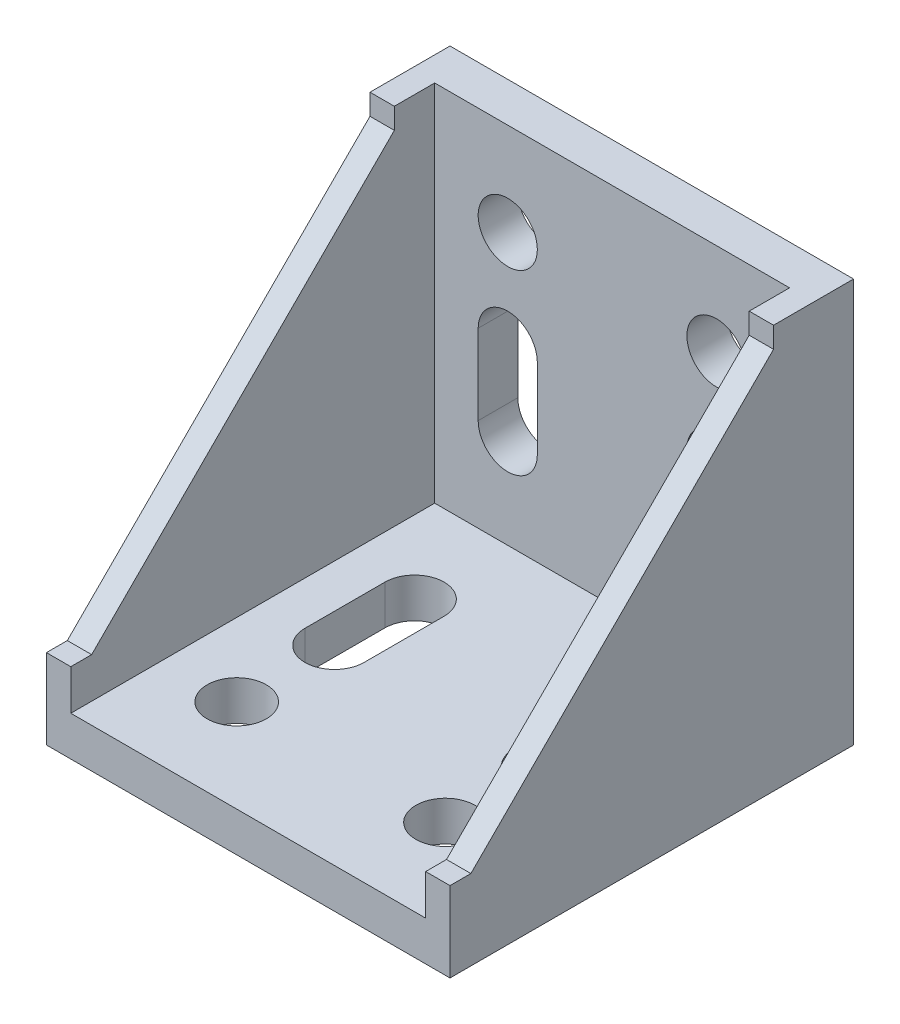
ISO-10303-21;
HEADER;
FILE_DESCRIPTION(('STEP AP214'),'2;1');
FILE_NAME('part.step','',(''),(''),'','','');
FILE_SCHEMA(('AUTOMOTIVE_DESIGN { 1 0 10303 214 1 1 1 1 }'));
ENDSEC;
DATA;
#1=APPLICATION_CONTEXT('core data for automotive mechanical design processes');
#2=APPLICATION_PROTOCOL_DEFINITION('international standard','automotive_design',2000,#1);
#3=PRODUCT_CONTEXT('',#1,'mechanical');
#4=PRODUCT('Part','Part','',(#3));
#5=PRODUCT_RELATED_PRODUCT_CATEGORY('part','',(#4));
#6=PRODUCT_DEFINITION_FORMATION('','',#4);
#7=PRODUCT_DEFINITION_CONTEXT('part definition',#1,'design');
#8=PRODUCT_DEFINITION('design','',#6,#7);
#9=PRODUCT_DEFINITION_SHAPE('','',#8);
#10=(LENGTH_UNIT() NAMED_UNIT(*) SI_UNIT(.MILLI.,.METRE.));
#11=(NAMED_UNIT(*) PLANE_ANGLE_UNIT() SI_UNIT($,.RADIAN.));
#12=(NAMED_UNIT(*) SI_UNIT($,.STERADIAN.) SOLID_ANGLE_UNIT());
#13=UNCERTAINTY_MEASURE_WITH_UNIT(LENGTH_MEASURE(1.E-05),#10,'distance_accuracy_value','');
#14=(GEOMETRIC_REPRESENTATION_CONTEXT(3) GLOBAL_UNCERTAINTY_ASSIGNED_CONTEXT((#13)) GLOBAL_UNIT_ASSIGNED_CONTEXT((#10,
#11,#12)) REPRESENTATION_CONTEXT('',''));
#15=CARTESIAN_POINT('',(0.,0.,0.));
#16=DIRECTION('',(0.,0.,1.));
#17=DIRECTION('',(1.,0.,0.));
#18=AXIS2_PLACEMENT_3D('',#15,#16,#17);
#19=CARTESIAN_POINT('',(-29.,-29.,5.7));
#20=DIRECTION('',(0.,1.,0.));
#21=DIRECTION('',(0.,0.,1.));
#22=AXIS2_PLACEMENT_3D('',#19,#20,#21);
#23=PLANE('',#22);
#24=DIRECTION('',(0.,0.,-1.));
#25=VECTOR('',#24,1.);
#26=CARTESIAN_POINT('',(19.25,-29.,19.0991177281499));
#27=LINE('',#26,#25);
#28=CARTESIAN_POINT('',(19.25,-29.,30.5991177281499));
#29=VERTEX_POINT('',#28);
#30=CARTESIAN_POINT('',(19.25,-29.,19.0991177281499));
#31=VERTEX_POINT('',#30);
#32=EDGE_CURVE('E239',#29,#31,#27,.T.);
#33=ORIENTED_EDGE('',*,*,#32,.T.);
#34=CARTESIAN_POINT('',(15.,-29.,19.0991177281499));
#35=DIRECTION('',(0.,1.,0.));
#36=DIRECTION('',(-1.,0.,0.));
#37=AXIS2_PLACEMENT_3D('',#34,#35,#36);
#38=CIRCLE('',#37,4.25);
#39=CARTESIAN_POINT('',(10.75,-29.,19.0991177281499));
#40=VERTEX_POINT('',#39);
#41=EDGE_CURVE('E233',#31,#40,#38,.T.);
#42=ORIENTED_EDGE('',*,*,#41,.T.);
#43=DIRECTION('',(0.,0.,1.));
#44=VECTOR('',#43,1.);
#45=CARTESIAN_POINT('',(10.75,-29.,19.0991177281499));
#46=LINE('',#45,#44);
#47=CARTESIAN_POINT('',(10.75,-29.,30.5991177281499));
#48=VERTEX_POINT('',#47);
#49=EDGE_CURVE('E242',#40,#48,#46,.T.);
#50=ORIENTED_EDGE('',*,*,#49,.T.);
#51=CARTESIAN_POINT('',(15.,-29.,30.5991177281499));
#52=DIRECTION('',(0.,1.,0.));
#53=DIRECTION('',(-1.,0.,0.));
#54=AXIS2_PLACEMENT_3D('',#51,#52,#53);
#55=CIRCLE('',#54,4.25);
#56=EDGE_CURVE('E50',#48,#29,#55,.T.);
#57=ORIENTED_EDGE('',*,*,#56,.T.);
#58=EDGE_LOOP('',(#33,#42,#50,#57));
#59=FACE_BOUND('',#58,.T.);
#60=CARTESIAN_POINT('',(15.,-29.,44.6519704906801));
#61=DIRECTION('',(0.,1.,0.));
#62=DIRECTION('',(-1.,0.,0.));
#63=AXIS2_PLACEMENT_3D('',#60,#61,#62);
#64=CIRCLE('',#63,4.25);
#65=CARTESIAN_POINT('',(10.75,-29.,44.6519704906801));
#66=VERTEX_POINT('',#65);
#67=EDGE_CURVE('E267',#66,#66,#64,.T.);
#68=ORIENTED_EDGE('',*,*,#67,.T.);
#69=EDGE_LOOP('',(#68));
#70=FACE_BOUND('',#69,.T.);
#71=CARTESIAN_POINT('',(-15.,-29.,44.6519704906801));
#72=DIRECTION('',(0.,-1.,0.));
#73=DIRECTION('',(1.,0.,0.));
#74=AXIS2_PLACEMENT_3D('',#71,#72,#73);
#75=CIRCLE('',#74,4.25);
#76=CARTESIAN_POINT('',(-10.75,-29.,44.6519704906801));
#77=VERTEX_POINT('',#76);
#78=EDGE_CURVE('E304',#77,#77,#75,.T.);
#79=ORIENTED_EDGE('',*,*,#78,.F.);
#80=EDGE_LOOP('',(#79));
#81=FACE_BOUND('',#80,.T.);
#82=DIRECTION('',(1.,0.,0.));
#83=VECTOR('',#82,1.);
#84=CARTESIAN_POINT('',(-29.,-29.,0.));
#85=LINE('',#84,#83);
#86=CARTESIAN_POINT('',(-29.,-29.,0.));
#87=VERTEX_POINT('',#86);
#88=CARTESIAN_POINT('',(29.,-29.,0.));
#89=VERTEX_POINT('',#88);
#90=EDGE_CURVE('E475',#87,#89,#85,.T.);
#91=ORIENTED_EDGE('',*,*,#90,.T.);
#92=DIRECTION('',(0.,0.,-1.));
#93=VECTOR('',#92,1.);
#94=CARTESIAN_POINT('',(29.,-29.,5.7));
#95=LINE('',#94,#93);
#96=CARTESIAN_POINT('',(29.,-29.,58.));
#97=VERTEX_POINT('',#96);
#98=EDGE_CURVE('E474',#97,#89,#95,.T.);
#99=ORIENTED_EDGE('',*,*,#98,.F.);
#100=DIRECTION('',(-1.,0.,0.));
#101=VECTOR('',#100,1.);
#102=CARTESIAN_POINT('',(29.,-29.,58.));
#103=LINE('',#102,#101);
#104=CARTESIAN_POINT('',(-29.,-29.,58.));
#105=VERTEX_POINT('',#104);
#106=EDGE_CURVE('E462',#97,#105,#103,.T.);
#107=ORIENTED_EDGE('',*,*,#106,.T.);
#108=DIRECTION('',(0.,0.,-1.));
#109=VECTOR('',#108,1.);
#110=CARTESIAN_POINT('',(-29.,-29.,5.7));
#111=LINE('',#110,#109);
#112=EDGE_CURVE('E486',#105,#87,#111,.T.);
#113=ORIENTED_EDGE('',*,*,#112,.T.);
#114=EDGE_LOOP('',(#91,#99,#107,#113));
#115=FACE_BOUND('',#114,.T.);
#116=CARTESIAN_POINT('',(-15.,-29.,19.0991177281499));
#117=DIRECTION('',(0.,-1.,0.));
#118=DIRECTION('',(1.,0.,0.));
#119=AXIS2_PLACEMENT_3D('',#116,#117,#118);
#120=CIRCLE('',#119,4.25);
#121=CARTESIAN_POINT('',(-19.25,-29.,19.0991177281499));
#122=VERTEX_POINT('',#121);
#123=CARTESIAN_POINT('',(-10.75,-29.,19.0991177281499));
#124=VERTEX_POINT('',#123);
#125=EDGE_CURVE('E273',#122,#124,#120,.T.);
#126=ORIENTED_EDGE('',*,*,#125,.F.);
#127=DIRECTION('',(0.,0.,-1.));
#128=VECTOR('',#127,1.);
#129=CARTESIAN_POINT('',(-19.25,-29.,19.0991177281499));
#130=LINE('',#129,#128);
#131=CARTESIAN_POINT('',(-19.25,-29.,30.5991177281499));
#132=VERTEX_POINT('',#131);
#133=EDGE_CURVE('E275',#132,#122,#130,.T.);
#134=ORIENTED_EDGE('',*,*,#133,.F.);
#135=CARTESIAN_POINT('',(-15.,-29.,30.5991177281499));
#136=DIRECTION('',(0.,-1.,0.));
#137=DIRECTION('',(1.,0.,0.));
#138=AXIS2_PLACEMENT_3D('',#135,#136,#137);
#139=CIRCLE('',#138,4.25);
#140=CARTESIAN_POINT('',(-10.75,-29.,30.5991177281499));
#141=VERTEX_POINT('',#140);
#142=EDGE_CURVE('E278',#141,#132,#139,.T.);
#143=ORIENTED_EDGE('',*,*,#142,.F.);
#144=DIRECTION('',(0.,0.,1.));
#145=VECTOR('',#144,1.);
#146=CARTESIAN_POINT('',(-10.75,-29.,19.0991177281499));
#147=LINE('',#146,#145);
#148=EDGE_CURVE('E281',#124,#141,#147,.T.);
#149=ORIENTED_EDGE('',*,*,#148,.F.);
#150=EDGE_LOOP('',(#126,#134,#143,#149));
#151=FACE_BOUND('',#150,.T.);
#152=ADVANCED_FACE('F35',(#59,#70,#81,#115,#151),#23,.F.);
#153=CARTESIAN_POINT('',(29.,-23.3,58.));
#154=DIRECTION('',(0.,1.,0.));
#155=DIRECTION('',(-1.,0.,0.));
#156=AXIS2_PLACEMENT_3D('',#153,#154,#155);
#157=PLANE('',#156);
#158=CARTESIAN_POINT('',(15.,-23.3,19.0991177281499));
#159=DIRECTION('',(0.,1.,0.));
#160=DIRECTION('',(-1.,0.,0.));
#161=AXIS2_PLACEMENT_3D('',#158,#159,#160);
#162=CIRCLE('',#161,4.25);
#163=CARTESIAN_POINT('',(19.25,-23.3,19.0991177281499));
#164=VERTEX_POINT('',#163);
#165=CARTESIAN_POINT('',(10.75,-23.3,19.0991177281499));
#166=VERTEX_POINT('',#165);
#167=EDGE_CURVE('E58',#164,#166,#162,.T.);
#168=ORIENTED_EDGE('',*,*,#167,.F.);
#169=DIRECTION('',(0.,0.,-1.));
#170=VECTOR('',#169,1.);
#171=CARTESIAN_POINT('',(19.25,-23.3,19.0991177281499));
#172=LINE('',#171,#170);
#173=CARTESIAN_POINT('',(19.25,-23.3,30.5991177281499));
#174=VERTEX_POINT('',#173);
#175=EDGE_CURVE('E248',#174,#164,#172,.T.);
#176=ORIENTED_EDGE('',*,*,#175,.F.);
#177=CARTESIAN_POINT('',(15.,-23.3,30.5991177281499));
#178=DIRECTION('',(0.,1.,0.));
#179=DIRECTION('',(-1.,0.,0.));
#180=AXIS2_PLACEMENT_3D('',#177,#178,#179);
#181=CIRCLE('',#180,4.25);
#182=CARTESIAN_POINT('',(10.75,-23.3,30.5991177281499));
#183=VERTEX_POINT('',#182);
#184=EDGE_CURVE('E251',#183,#174,#181,.T.);
#185=ORIENTED_EDGE('',*,*,#184,.F.);
#186=DIRECTION('',(0.,0.,1.));
#187=VECTOR('',#186,1.);
#188=CARTESIAN_POINT('',(10.75,-23.3,19.0991177281499));
#189=LINE('',#188,#187);
#190=EDGE_CURVE('E257',#166,#183,#189,.T.);
#191=ORIENTED_EDGE('',*,*,#190,.F.);
#192=EDGE_LOOP('',(#168,#176,#185,#191));
#193=FACE_BOUND('',#192,.T.);
#194=CARTESIAN_POINT('',(15.,-23.3,44.6519704906801));
#195=DIRECTION('',(0.,1.,0.));
#196=DIRECTION('',(-1.,0.,0.));
#197=AXIS2_PLACEMENT_3D('',#194,#195,#196);
#198=CIRCLE('',#197,4.25);
#199=CARTESIAN_POINT('',(10.75,-23.3,44.6519704906801));
#200=VERTEX_POINT('',#199);
#201=EDGE_CURVE('E263',#200,#200,#198,.T.);
#202=ORIENTED_EDGE('',*,*,#201,.F.);
#203=EDGE_LOOP('',(#202));
#204=FACE_BOUND('',#203,.T.);
#205=CARTESIAN_POINT('',(-15.,-23.3,44.6519704906801));
#206=DIRECTION('',(0.,-1.,0.));
#207=DIRECTION('',(1.,0.,0.));
#208=AXIS2_PLACEMENT_3D('',#205,#206,#207);
#209=CIRCLE('',#208,4.25);
#210=CARTESIAN_POINT('',(-10.75,-23.3,44.6519704906801));
#211=VERTEX_POINT('',#210);
#212=EDGE_CURVE('E297',#211,#211,#209,.T.);
#213=ORIENTED_EDGE('',*,*,#212,.T.);
#214=EDGE_LOOP('',(#213));
#215=FACE_BOUND('',#214,.T.);
#216=DIRECTION('',(0.,0.,1.));
#217=VECTOR('',#216,1.);
#218=CARTESIAN_POINT('',(25.5,-23.3,58.));
#219=LINE('',#218,#217);
#220=CARTESIAN_POINT('',(25.5,-23.3,5.7));
#221=VERTEX_POINT('',#220);
#222=CARTESIAN_POINT('',(25.5,-23.3,58.));
#223=VERTEX_POINT('',#222);
#224=EDGE_CURVE('E362',#221,#223,#219,.T.);
#225=ORIENTED_EDGE('',*,*,#224,.F.);
#226=DIRECTION('',(-1.,0.,0.));
#227=VECTOR('',#226,1.);
#228=CARTESIAN_POINT('',(29.,-23.3,5.7));
#229=LINE('',#228,#227);
#230=CARTESIAN_POINT('',(-25.5,-23.3,5.7));
#231=VERTEX_POINT('',#230);
#232=EDGE_CURVE('E469',#221,#231,#229,.T.);
#233=ORIENTED_EDGE('',*,*,#232,.T.);
#234=DIRECTION('',(0.,0.,1.));
#235=VECTOR('',#234,1.);
#236=CARTESIAN_POINT('',(-25.5,-23.3,58.));
#237=LINE('',#236,#235);
#238=CARTESIAN_POINT('',(-25.5,-23.3,58.));
#239=VERTEX_POINT('',#238);
#240=EDGE_CURVE('E424',#231,#239,#237,.T.);
#241=ORIENTED_EDGE('',*,*,#240,.T.);
#242=DIRECTION('',(1.,0.,0.));
#243=VECTOR('',#242,1.);
#244=CARTESIAN_POINT('',(29.,-23.3,58.));
#245=LINE('',#244,#243);
#246=EDGE_CURVE('E467',#239,#223,#245,.T.);
#247=ORIENTED_EDGE('',*,*,#246,.T.);
#248=EDGE_LOOP('',(#225,#233,#241,#247));
#249=FACE_BOUND('',#248,.T.);
#250=DIRECTION('',(0.,0.,-1.));
#251=VECTOR('',#250,1.);
#252=CARTESIAN_POINT('',(-19.25,-23.3,19.0991177281499));
#253=LINE('',#252,#251);
#254=CARTESIAN_POINT('',(-19.25,-23.3,30.5991177281499));
#255=VERTEX_POINT('',#254);
#256=CARTESIAN_POINT('',(-19.25,-23.3,19.0991177281499));
#257=VERTEX_POINT('',#256);
#258=EDGE_CURVE('E286',#255,#257,#253,.T.);
#259=ORIENTED_EDGE('',*,*,#258,.T.);
#260=CARTESIAN_POINT('',(-15.,-23.3,19.0991177281499));
#261=DIRECTION('',(0.,-1.,0.));
#262=DIRECTION('',(1.,0.,0.));
#263=AXIS2_PLACEMENT_3D('',#260,#261,#262);
#264=CIRCLE('',#263,4.25);
#265=CARTESIAN_POINT('',(-10.75,-23.3,19.0991177281499));
#266=VERTEX_POINT('',#265);
#267=EDGE_CURVE('E270',#257,#266,#264,.T.);
#268=ORIENTED_EDGE('',*,*,#267,.T.);
#269=DIRECTION('',(0.,0.,1.));
#270=VECTOR('',#269,1.);
#271=CARTESIAN_POINT('',(-10.75,-23.3,19.0991177281499));
#272=LINE('',#271,#270);
#273=CARTESIAN_POINT('',(-10.75,-23.3,30.5991177281499));
#274=VERTEX_POINT('',#273);
#275=EDGE_CURVE('E276',#266,#274,#272,.T.);
#276=ORIENTED_EDGE('',*,*,#275,.T.);
#277=CARTESIAN_POINT('',(-15.,-23.3,30.5991177281499));
#278=DIRECTION('',(0.,-1.,0.));
#279=DIRECTION('',(1.,0.,0.));
#280=AXIS2_PLACEMENT_3D('',#277,#278,#279);
#281=CIRCLE('',#280,4.25);
#282=EDGE_CURVE('E289',#274,#255,#281,.T.);
#283=ORIENTED_EDGE('',*,*,#282,.T.);
#284=EDGE_LOOP('',(#259,#268,#276,#283));
#285=FACE_BOUND('',#284,.T.);
#286=ADVANCED_FACE('F523',(#193,#204,#215,#249,#285),#157,.T.);
#287=CARTESIAN_POINT('',(29.,-29.,5.7));
#288=DIRECTION('',(0.,0.,1.));
#289=DIRECTION('',(1.,0.,0.));
#290=AXIS2_PLACEMENT_3D('',#287,#288,#289);
#291=PLANE('',#290);
#292=CARTESIAN_POINT('',(15.,15.6519704906801,5.7));
#293=DIRECTION('',(0.,0.,-1.));
#294=DIRECTION('',(-1.,0.,0.));
#295=AXIS2_PLACEMENT_3D('',#292,#293,#294);
#296=CIRCLE('',#295,4.25);
#297=CARTESIAN_POINT('',(10.75,15.6519704906801,5.7));
#298=VERTEX_POINT('',#297);
#299=EDGE_CURVE('E334',#298,#298,#296,.T.);
#300=ORIENTED_EDGE('',*,*,#299,.T.);
#301=EDGE_LOOP('',(#300));
#302=FACE_BOUND('',#301,.T.);
#303=DIRECTION('',(0.,-1.,0.));
#304=VECTOR('',#303,1.);
#305=CARTESIAN_POINT('',(25.5,-23.3,5.7));
#306=LINE('',#305,#304);
#307=CARTESIAN_POINT('',(25.5,29.,5.7));
#308=VERTEX_POINT('',#307);
#309=EDGE_CURVE('E347',#308,#221,#306,.T.);
#310=ORIENTED_EDGE('',*,*,#309,.F.);
#311=DIRECTION('',(-1.,0.,0.));
#312=VECTOR('',#311,1.);
#313=CARTESIAN_POINT('',(-29.,29.,5.7));
#314=LINE('',#313,#312);
#315=CARTESIAN_POINT('',(-25.5,29.,5.7));
#316=VERTEX_POINT('',#315);
#317=EDGE_CURVE('E472',#308,#316,#314,.T.);
#318=ORIENTED_EDGE('',*,*,#317,.T.);
#319=DIRECTION('',(0.,-1.,0.));
#320=VECTOR('',#319,1.);
#321=CARTESIAN_POINT('',(-25.5,-23.3,5.7));
#322=LINE('',#321,#320);
#323=EDGE_CURVE('E421',#316,#231,#322,.T.);
#324=ORIENTED_EDGE('',*,*,#323,.T.);
#325=ORIENTED_EDGE('',*,*,#232,.F.);
#326=EDGE_LOOP('',(#310,#318,#324,#325));
#327=FACE_BOUND('',#326,.T.);
#328=CARTESIAN_POINT('',(-15.,-9.90088227185011,5.7));
#329=DIRECTION('',(0.,0.,1.));
#330=DIRECTION('',(1.,0.,0.));
#331=AXIS2_PLACEMENT_3D('',#328,#329,#330);
#332=CIRCLE('',#331,4.25);
#333=CARTESIAN_POINT('',(-19.25,-9.90088227185011,5.7));
#334=VERTEX_POINT('',#333);
#335=CARTESIAN_POINT('',(-10.75,-9.90088227185011,5.7));
#336=VERTEX_POINT('',#335);
#337=EDGE_CURVE('E374',#334,#336,#332,.T.);
#338=ORIENTED_EDGE('',*,*,#337,.F.);
#339=DIRECTION('',(0.,-1.,0.));
#340=VECTOR('',#339,1.);
#341=CARTESIAN_POINT('',(-19.25,-9.90088227185011,5.7));
#342=LINE('',#341,#340);
#343=CARTESIAN_POINT('',(-19.25,1.59911772814989,5.7));
#344=VERTEX_POINT('',#343);
#345=EDGE_CURVE('E387',#344,#334,#342,.T.);
#346=ORIENTED_EDGE('',*,*,#345,.F.);
#347=CARTESIAN_POINT('',(-15.,1.59911772814989,5.7));
#348=DIRECTION('',(0.,0.,1.));
#349=DIRECTION('',(1.,0.,0.));
#350=AXIS2_PLACEMENT_3D('',#347,#348,#349);
#351=CIRCLE('',#350,4.25);
#352=CARTESIAN_POINT('',(-10.75,1.59911772814989,5.7));
#353=VERTEX_POINT('',#352);
#354=EDGE_CURVE('E401',#353,#344,#351,.T.);
#355=ORIENTED_EDGE('',*,*,#354,.F.);
#356=DIRECTION('',(0.,1.,0.));
#357=VECTOR('',#356,1.);
#358=CARTESIAN_POINT('',(-10.75,-9.90088227185011,5.7));
#359=LINE('',#358,#357);
#360=EDGE_CURVE('E398',#336,#353,#359,.T.);
#361=ORIENTED_EDGE('',*,*,#360,.F.);
#362=EDGE_LOOP('',(#338,#346,#355,#361));
#363=FACE_BOUND('',#362,.T.);
#364=CARTESIAN_POINT('',(-15.,15.6519704906801,5.7));
#365=DIRECTION('',(0.,0.,1.));
#366=DIRECTION('',(1.,0.,0.));
#367=AXIS2_PLACEMENT_3D('',#364,#365,#366);
#368=CIRCLE('',#367,4.25);
#369=CARTESIAN_POINT('',(-10.75,15.6519704906801,5.7));
#370=VERTEX_POINT('',#369);
#371=EDGE_CURVE('E408',#370,#370,#368,.T.);
#372=ORIENTED_EDGE('',*,*,#371,.F.);
#373=EDGE_LOOP('',(#372));
#374=FACE_BOUND('',#373,.T.);
#375=DIRECTION('',(0.,-1.,0.));
#376=VECTOR('',#375,1.);
#377=CARTESIAN_POINT('',(19.25,-9.90088227185011,5.7));
#378=LINE('',#377,#376);
#379=CARTESIAN_POINT('',(19.25,1.59911772814989,5.7));
#380=VERTEX_POINT('',#379);
#381=CARTESIAN_POINT('',(19.25,-9.90088227185011,5.7));
#382=VERTEX_POINT('',#381);
#383=EDGE_CURVE('E323',#380,#382,#378,.T.);
#384=ORIENTED_EDGE('',*,*,#383,.T.);
#385=CARTESIAN_POINT('',(15.,-9.90088227185011,5.7));
#386=DIRECTION('',(0.,0.,-1.));
#387=DIRECTION('',(-1.,0.,0.));
#388=AXIS2_PLACEMENT_3D('',#385,#386,#387);
#389=CIRCLE('',#388,4.25);
#390=CARTESIAN_POINT('',(10.75,-9.90088227185011,5.7));
#391=VERTEX_POINT('',#390);
#392=EDGE_CURVE('E307',#382,#391,#389,.T.);
#393=ORIENTED_EDGE('',*,*,#392,.T.);
#394=DIRECTION('',(0.,1.,0.));
#395=VECTOR('',#394,1.);
#396=CARTESIAN_POINT('',(10.75,-9.90088227185011,5.7));
#397=LINE('',#396,#395);
#398=CARTESIAN_POINT('',(10.75,1.59911772814989,5.7));
#399=VERTEX_POINT('',#398);
#400=EDGE_CURVE('E313',#391,#399,#397,.T.);
#401=ORIENTED_EDGE('',*,*,#400,.T.);
#402=CARTESIAN_POINT('',(15.,1.59911772814989,5.7));
#403=DIRECTION('',(0.,0.,-1.));
#404=DIRECTION('',(-1.,0.,0.));
#405=AXIS2_PLACEMENT_3D('',#402,#403,#404);
#406=CIRCLE('',#405,4.25);
#407=EDGE_CURVE('E326',#399,#380,#406,.T.);
#408=ORIENTED_EDGE('',*,*,#407,.T.);
#409=EDGE_LOOP('',(#384,#393,#401,#408));
#410=FACE_BOUND('',#409,.T.);
#411=ADVANCED_FACE('F544',(#302,#327,#363,#374,#410),#291,.T.);
#412=CARTESIAN_POINT('',(29.,-29.,0.));
#413=DIRECTION('',(0.,0.,1.));
#414=DIRECTION('',(1.,0.,0.));
#415=AXIS2_PLACEMENT_3D('',#412,#413,#414);
#416=PLANE('',#415);
#417=CARTESIAN_POINT('',(15.,15.6519704906801,0.));
#418=DIRECTION('',(0.,0.,-1.));
#419=DIRECTION('',(-1.,0.,0.));
#420=AXIS2_PLACEMENT_3D('',#417,#418,#419);
#421=CIRCLE('',#420,4.25);
#422=CARTESIAN_POINT('',(10.75,15.6519704906801,0.));
#423=VERTEX_POINT('',#422);
#424=EDGE_CURVE('E341',#423,#423,#421,.T.);
#425=ORIENTED_EDGE('',*,*,#424,.F.);
#426=EDGE_LOOP('',(#425));
#427=FACE_BOUND('',#426,.T.);
#428=DIRECTION('',(0.,-1.,0.));
#429=VECTOR('',#428,1.);
#430=CARTESIAN_POINT('',(-19.25,-9.90088227185011,0.));
#431=LINE('',#430,#429);
#432=CARTESIAN_POINT('',(-19.25,1.59911772814989,0.));
#433=VERTEX_POINT('',#432);
#434=CARTESIAN_POINT('',(-19.25,-9.90088227185011,0.));
#435=VERTEX_POINT('',#434);
#436=EDGE_CURVE('E393',#433,#435,#431,.T.);
#437=ORIENTED_EDGE('',*,*,#436,.T.);
#438=CARTESIAN_POINT('',(-15.,-9.90088227185011,0.));
#439=DIRECTION('',(0.,0.,1.));
#440=DIRECTION('',(1.,0.,0.));
#441=AXIS2_PLACEMENT_3D('',#438,#439,#440);
#442=CIRCLE('',#441,4.25);
#443=CARTESIAN_POINT('',(-10.75,-9.90088227185011,0.));
#444=VERTEX_POINT('',#443);
#445=EDGE_CURVE('E383',#435,#444,#442,.T.);
#446=ORIENTED_EDGE('',*,*,#445,.T.);
#447=DIRECTION('',(0.,1.,0.));
#448=VECTOR('',#447,1.);
#449=CARTESIAN_POINT('',(-10.75,-9.90088227185011,0.));
#450=LINE('',#449,#448);
#451=CARTESIAN_POINT('',(-10.75,1.59911772814988,0.));
#452=VERTEX_POINT('',#451);
#453=EDGE_CURVE('E386',#444,#452,#450,.T.);
#454=ORIENTED_EDGE('',*,*,#453,.T.);
#455=CARTESIAN_POINT('',(-15.,1.59911772814989,0.));
#456=DIRECTION('',(0.,0.,1.));
#457=DIRECTION('',(1.,0.,0.));
#458=AXIS2_PLACEMENT_3D('',#455,#456,#457);
#459=CIRCLE('',#458,4.25);
#460=EDGE_CURVE('E390',#452,#433,#459,.T.);
#461=ORIENTED_EDGE('',*,*,#460,.T.);
#462=EDGE_LOOP('',(#437,#446,#454,#461));
#463=FACE_BOUND('',#462,.T.);
#464=CARTESIAN_POINT('',(-15.,15.6519704906801,0.));
#465=DIRECTION('',(0.,0.,1.));
#466=DIRECTION('',(1.,0.,0.));
#467=AXIS2_PLACEMENT_3D('',#464,#465,#466);
#468=CIRCLE('',#467,4.25);
#469=CARTESIAN_POINT('',(-10.75,15.6519704906801,0.));
#470=VERTEX_POINT('',#469);
#471=EDGE_CURVE('E415',#470,#470,#468,.T.);
#472=ORIENTED_EDGE('',*,*,#471,.T.);
#473=EDGE_LOOP('',(#472));
#474=FACE_BOUND('',#473,.T.);
#475=DIRECTION('',(-1.,0.,0.));
#476=VECTOR('',#475,1.);
#477=CARTESIAN_POINT('',(-29.,29.,0.));
#478=LINE('',#477,#476);
#479=CARTESIAN_POINT('',(29.,29.,0.));
#480=VERTEX_POINT('',#479);
#481=CARTESIAN_POINT('',(-29.,29.,0.));
#482=VERTEX_POINT('',#481);
#483=EDGE_CURVE('E478',#480,#482,#478,.T.);
#484=ORIENTED_EDGE('',*,*,#483,.F.);
#485=DIRECTION('',(0.,1.,0.));
#486=VECTOR('',#485,1.);
#487=CARTESIAN_POINT('',(29.,29.,0.));
#488=LINE('',#487,#486);
#489=EDGE_CURVE('E471',#89,#480,#488,.T.);
#490=ORIENTED_EDGE('',*,*,#489,.F.);
#491=ORIENTED_EDGE('',*,*,#90,.F.);
#492=DIRECTION('',(0.,-1.,0.));
#493=VECTOR('',#492,1.);
#494=CARTESIAN_POINT('',(-29.,29.,0.));
#495=LINE('',#494,#493);
#496=EDGE_CURVE('E481',#482,#87,#495,.T.);
#497=ORIENTED_EDGE('',*,*,#496,.F.);
#498=EDGE_LOOP('',(#484,#490,#491,#497));
#499=FACE_BOUND('',#498,.T.);
#500=CARTESIAN_POINT('',(15.,-9.90088227185011,0.));
#501=DIRECTION('',(0.,0.,-1.));
#502=DIRECTION('',(-1.,0.,0.));
#503=AXIS2_PLACEMENT_3D('',#500,#501,#502);
#504=CIRCLE('',#503,4.25);
#505=CARTESIAN_POINT('',(19.25,-9.90088227185011,0.));
#506=VERTEX_POINT('',#505);
#507=CARTESIAN_POINT('',(10.75,-9.90088227185011,0.));
#508=VERTEX_POINT('',#507);
#509=EDGE_CURVE('E310',#506,#508,#504,.T.);
#510=ORIENTED_EDGE('',*,*,#509,.F.);
#511=DIRECTION('',(0.,-1.,0.));
#512=VECTOR('',#511,1.);
#513=CARTESIAN_POINT('',(19.25,-9.90088227185011,0.));
#514=LINE('',#513,#512);
#515=CARTESIAN_POINT('',(19.25,1.59911772814988,0.));
#516=VERTEX_POINT('',#515);
#517=EDGE_CURVE('E312',#516,#506,#514,.T.);
#518=ORIENTED_EDGE('',*,*,#517,.F.);
#519=CARTESIAN_POINT('',(15.,1.59911772814989,0.));
#520=DIRECTION('',(0.,0.,-1.));
#521=DIRECTION('',(-1.,0.,0.));
#522=AXIS2_PLACEMENT_3D('',#519,#520,#521);
#523=CIRCLE('',#522,4.25);
#524=CARTESIAN_POINT('',(10.75,1.59911772814989,0.));
#525=VERTEX_POINT('',#524);
#526=EDGE_CURVE('E315',#525,#516,#523,.T.);
#527=ORIENTED_EDGE('',*,*,#526,.F.);
#528=DIRECTION('',(0.,1.,0.));
#529=VECTOR('',#528,1.);
#530=CARTESIAN_POINT('',(10.75,-9.90088227185011,0.));
#531=LINE('',#530,#529);
#532=EDGE_CURVE('E318',#508,#525,#531,.T.);
#533=ORIENTED_EDGE('',*,*,#532,.F.);
#534=EDGE_LOOP('',(#510,#518,#527,#533));
#535=FACE_BOUND('',#534,.T.);
#536=ADVANCED_FACE('F498',(#427,#463,#474,#499,#535),#416,.F.);
#537=CARTESIAN_POINT('',(29.,29.,5.7));
#538=DIRECTION('',(-1.,0.,0.));
#539=DIRECTION('',(0.,-1.,0.));
#540=AXIS2_PLACEMENT_3D('',#537,#538,#539);
#541=PLANE('',#540);
#542=DIRECTION('',(0.,-1.,0.));
#543=VECTOR('',#542,1.);
#544=CARTESIAN_POINT('',(29.,-29.,58.));
#545=LINE('',#544,#543);
#546=CARTESIAN_POINT('',(29.,-17.5,58.));
#547=VERTEX_POINT('',#546);
#548=EDGE_CURVE('E454',#547,#97,#545,.T.);
#549=ORIENTED_EDGE('',*,*,#548,.T.);
#550=ORIENTED_EDGE('',*,*,#98,.T.);
#551=ORIENTED_EDGE('',*,*,#489,.T.);
#552=DIRECTION('',(0.,0.,-1.));
#553=VECTOR('',#552,1.);
#554=CARTESIAN_POINT('',(29.,29.,5.7));
#555=LINE('',#554,#553);
#556=CARTESIAN_POINT('',(29.,29.,11.5));
#557=VERTEX_POINT('',#556);
#558=EDGE_CURVE('E11',#557,#480,#555,.T.);
#559=ORIENTED_EDGE('',*,*,#558,.F.);
#560=DIRECTION('',(0.,1.,0.));
#561=VECTOR('',#560,1.);
#562=CARTESIAN_POINT('',(29.,29.,11.5));
#563=LINE('',#562,#561);
#564=CARTESIAN_POINT('',(29.,26.,11.5));
#565=VERTEX_POINT('',#564);
#566=EDGE_CURVE('E344',#565,#557,#563,.T.);
#567=ORIENTED_EDGE('',*,*,#566,.F.);
#568=DIRECTION('',(0.,0.707106781186547,-0.707106781186547));
#569=VECTOR('',#568,1.);
#570=CARTESIAN_POINT('',(29.,26.,11.5));
#571=LINE('',#570,#569);
#572=CARTESIAN_POINT('',(29.,-17.5,55.));
#573=VERTEX_POINT('',#572);
#574=EDGE_CURVE('E368',#573,#565,#571,.T.);
#575=ORIENTED_EDGE('',*,*,#574,.F.);
#576=DIRECTION('',(0.,0.,-1.));
#577=VECTOR('',#576,1.);
#578=CARTESIAN_POINT('',(29.,-17.5,55.));
#579=LINE('',#578,#577);
#580=EDGE_CURVE('E351',#547,#573,#579,.T.);
#581=ORIENTED_EDGE('',*,*,#580,.F.);
#582=EDGE_LOOP('',(#549,#550,#551,#559,#567,#575,#581));
#583=FACE_BOUND('',#582,.T.);
#584=ADVANCED_FACE('F37',(#583),#541,.F.);
#585=CARTESIAN_POINT('',(-29.,29.,5.7));
#586=DIRECTION('',(0.,-1.,0.));
#587=DIRECTION('',(0.,0.,-1.));
#588=AXIS2_PLACEMENT_3D('',#585,#586,#587);
#589=PLANE('',#588);
#590=DIRECTION('',(0.,0.,-1.));
#591=VECTOR('',#590,1.);
#592=CARTESIAN_POINT('',(-25.5,29.,5.7));
#593=LINE('',#592,#591);
#594=CARTESIAN_POINT('',(-25.5,29.,11.5));
#595=VERTEX_POINT('',#594);
#596=EDGE_CURVE('E440',#595,#316,#593,.T.);
#597=ORIENTED_EDGE('',*,*,#596,.T.);
#598=ORIENTED_EDGE('',*,*,#317,.F.);
#599=DIRECTION('',(0.,0.,-1.));
#600=VECTOR('',#599,1.);
#601=CARTESIAN_POINT('',(25.5,29.,5.7));
#602=LINE('',#601,#600);
#603=CARTESIAN_POINT('',(25.5,29.,11.5));
#604=VERTEX_POINT('',#603);
#605=EDGE_CURVE('E350',#604,#308,#602,.T.);
#606=ORIENTED_EDGE('',*,*,#605,.F.);
#607=DIRECTION('',(1.,0.,0.));
#608=VECTOR('',#607,1.);
#609=CARTESIAN_POINT('',(25.5,29.,11.5));
#610=LINE('',#609,#608);
#611=EDGE_CURVE('E365',#604,#557,#610,.T.);
#612=ORIENTED_EDGE('',*,*,#611,.T.);
#613=ORIENTED_EDGE('',*,*,#558,.T.);
#614=ORIENTED_EDGE('',*,*,#483,.T.);
#615=DIRECTION('',(0.,0.,-1.));
#616=VECTOR('',#615,1.);
#617=CARTESIAN_POINT('',(-29.,29.,5.7));
#618=LINE('',#617,#616);
#619=CARTESIAN_POINT('',(-29.,29.,11.5));
#620=VERTEX_POINT('',#619);
#621=EDGE_CURVE('E43',#620,#482,#618,.T.);
#622=ORIENTED_EDGE('',*,*,#621,.F.);
#623=DIRECTION('',(-1.,0.,0.));
#624=VECTOR('',#623,1.);
#625=CARTESIAN_POINT('',(-25.5,29.,11.5));
#626=LINE('',#625,#624);
#627=EDGE_CURVE('E451',#595,#620,#626,.T.);
#628=ORIENTED_EDGE('',*,*,#627,.F.);
#629=EDGE_LOOP('',(#597,#598,#606,#612,#613,#614,#622,#628));
#630=FACE_BOUND('',#629,.T.);
#631=ADVANCED_FACE('F494',(#630),#589,.F.);
#632=CARTESIAN_POINT('',(-29.,29.,5.7));
#633=DIRECTION('',(1.,0.,0.));
#634=DIRECTION('',(0.,1.,0.));
#635=AXIS2_PLACEMENT_3D('',#632,#633,#634);
#636=PLANE('',#635);
#637=DIRECTION('',(0.,1.,0.));
#638=VECTOR('',#637,1.);
#639=CARTESIAN_POINT('',(-29.,-29.,58.));
#640=LINE('',#639,#638);
#641=CARTESIAN_POINT('',(-29.,-17.5,58.));
#642=VERTEX_POINT('',#641);
#643=EDGE_CURVE('E465',#105,#642,#640,.T.);
#644=ORIENTED_EDGE('',*,*,#643,.T.);
#645=DIRECTION('',(0.,0.,-1.));
#646=VECTOR('',#645,1.);
#647=CARTESIAN_POINT('',(-29.,-17.5,55.));
#648=LINE('',#647,#646);
#649=CARTESIAN_POINT('',(-29.,-17.5,55.));
#650=VERTEX_POINT('',#649);
#651=EDGE_CURVE('E418',#642,#650,#648,.T.);
#652=ORIENTED_EDGE('',*,*,#651,.T.);
#653=DIRECTION('',(0.,0.707106781186547,-0.707106781186547));
#654=VECTOR('',#653,1.);
#655=CARTESIAN_POINT('',(-29.,26.,11.5));
#656=LINE('',#655,#654);
#657=CARTESIAN_POINT('',(-29.,26.,11.5));
#658=VERTEX_POINT('',#657);
#659=EDGE_CURVE('E446',#650,#658,#656,.T.);
#660=ORIENTED_EDGE('',*,*,#659,.T.);
#661=DIRECTION('',(0.,1.,0.));
#662=VECTOR('',#661,1.);
#663=CARTESIAN_POINT('',(-29.,29.,11.5));
#664=LINE('',#663,#662);
#665=EDGE_CURVE('E425',#658,#620,#664,.T.);
#666=ORIENTED_EDGE('',*,*,#665,.T.);
#667=ORIENTED_EDGE('',*,*,#621,.T.);
#668=ORIENTED_EDGE('',*,*,#496,.T.);
#669=ORIENTED_EDGE('',*,*,#112,.F.);
#670=EDGE_LOOP('',(#644,#652,#660,#666,#667,#668,#669));
#671=FACE_BOUND('',#670,.T.);
#672=ADVANCED_FACE('F489',(#671),#636,.F.);
#673=CARTESIAN_POINT('',(29.,-23.3,58.));
#674=DIRECTION('',(0.,0.,1.));
#675=DIRECTION('',(1.,0.,0.));
#676=AXIS2_PLACEMENT_3D('',#673,#674,#675);
#677=PLANE('',#676);
#678=DIRECTION('',(-1.,0.,0.));
#679=VECTOR('',#678,1.);
#680=CARTESIAN_POINT('',(-25.5,-17.5,58.));
#681=LINE('',#680,#679);
#682=CARTESIAN_POINT('',(-25.5,-17.5,58.));
#683=VERTEX_POINT('',#682);
#684=EDGE_CURVE('E443',#683,#642,#681,.T.);
#685=ORIENTED_EDGE('',*,*,#684,.T.);
#686=ORIENTED_EDGE('',*,*,#643,.F.);
#687=ORIENTED_EDGE('',*,*,#106,.F.);
#688=ORIENTED_EDGE('',*,*,#548,.F.);
#689=DIRECTION('',(1.,0.,0.));
#690=VECTOR('',#689,1.);
#691=CARTESIAN_POINT('',(25.5,-17.5,58.));
#692=LINE('',#691,#690);
#693=CARTESIAN_POINT('',(25.5,-17.5,58.));
#694=VERTEX_POINT('',#693);
#695=EDGE_CURVE('E371',#694,#547,#692,.T.);
#696=ORIENTED_EDGE('',*,*,#695,.F.);
#697=DIRECTION('',(0.,1.,0.));
#698=VECTOR('',#697,1.);
#699=CARTESIAN_POINT('',(25.5,-17.5,58.));
#700=LINE('',#699,#698);
#701=EDGE_CURVE('E360',#223,#694,#700,.T.);
#702=ORIENTED_EDGE('',*,*,#701,.F.);
#703=ORIENTED_EDGE('',*,*,#246,.F.);
#704=DIRECTION('',(0.,1.,0.));
#705=VECTOR('',#704,1.);
#706=CARTESIAN_POINT('',(-25.5,-17.5,58.));
#707=LINE('',#706,#705);
#708=EDGE_CURVE('E428',#239,#683,#707,.T.);
#709=ORIENTED_EDGE('',*,*,#708,.T.);
#710=EDGE_LOOP('',(#685,#686,#687,#688,#696,#702,#703,#709));
#711=FACE_BOUND('',#710,.T.);
#712=ADVANCED_FACE('F509',(#711),#677,.T.);
#713=CARTESIAN_POINT('',(-25.5,29.,11.5));
#714=DIRECTION('',(0.,0.,1.));
#715=DIRECTION('',(1.,0.,0.));
#716=AXIS2_PLACEMENT_3D('',#713,#714,#715);
#717=PLANE('',#716);
#718=ORIENTED_EDGE('',*,*,#665,.F.);
#719=DIRECTION('',(-1.,0.,0.));
#720=VECTOR('',#719,1.);
#721=CARTESIAN_POINT('',(-25.5,26.,11.5));
#722=LINE('',#721,#720);
#723=CARTESIAN_POINT('',(-25.5,26.,11.5));
#724=VERTEX_POINT('',#723);
#725=EDGE_CURVE('E455',#724,#658,#722,.T.);
#726=ORIENTED_EDGE('',*,*,#725,.F.);
#727=DIRECTION('',(0.,1.,0.));
#728=VECTOR('',#727,1.);
#729=CARTESIAN_POINT('',(-25.5,29.,11.5));
#730=LINE('',#729,#728);
#731=EDGE_CURVE('E437',#724,#595,#730,.T.);
#732=ORIENTED_EDGE('',*,*,#731,.T.);
#733=ORIENTED_EDGE('',*,*,#627,.T.);
#734=EDGE_LOOP('',(#718,#726,#732,#733));
#735=FACE_BOUND('',#734,.T.);
#736=ADVANCED_FACE('F539',(#735),#717,.T.);
#737=CARTESIAN_POINT('',(-25.5,26.,11.5));
#738=DIRECTION('',(0.,0.707106781186548,0.707106781186548));
#739=DIRECTION('',(0.,-0.707106781186548,0.707106781186548));
#740=AXIS2_PLACEMENT_3D('',#737,#738,#739);
#741=PLANE('',#740);
#742=ORIENTED_EDGE('',*,*,#659,.F.);
#743=DIRECTION('',(-1.,0.,0.));
#744=VECTOR('',#743,1.);
#745=CARTESIAN_POINT('',(-25.5,-17.5,55.));
#746=LINE('',#745,#744);
#747=CARTESIAN_POINT('',(-25.5,-17.5,55.));
#748=VERTEX_POINT('',#747);
#749=EDGE_CURVE('E457',#748,#650,#746,.T.);
#750=ORIENTED_EDGE('',*,*,#749,.F.);
#751=DIRECTION('',(0.,0.707106781186547,-0.707106781186547));
#752=VECTOR('',#751,1.);
#753=CARTESIAN_POINT('',(-25.5,26.,11.5));
#754=LINE('',#753,#752);
#755=EDGE_CURVE('E434',#748,#724,#754,.T.);
#756=ORIENTED_EDGE('',*,*,#755,.T.);
#757=ORIENTED_EDGE('',*,*,#725,.T.);
#758=EDGE_LOOP('',(#742,#750,#756,#757));
#759=FACE_BOUND('',#758,.T.);
#760=ADVANCED_FACE('F537',(#759),#741,.T.);
#761=CARTESIAN_POINT('',(-25.5,-17.5,55.));
#762=DIRECTION('',(0.,1.,0.));
#763=DIRECTION('',(-1.,0.,0.));
#764=AXIS2_PLACEMENT_3D('',#761,#762,#763);
#765=PLANE('',#764);
#766=ORIENTED_EDGE('',*,*,#651,.F.);
#767=ORIENTED_EDGE('',*,*,#684,.F.);
#768=DIRECTION('',(0.,0.,-1.));
#769=VECTOR('',#768,1.);
#770=CARTESIAN_POINT('',(-25.5,-17.5,55.));
#771=LINE('',#770,#769);
#772=EDGE_CURVE('E431',#683,#748,#771,.T.);
#773=ORIENTED_EDGE('',*,*,#772,.T.);
#774=ORIENTED_EDGE('',*,*,#749,.T.);
#775=EDGE_LOOP('',(#766,#767,#773,#774));
#776=FACE_BOUND('',#775,.T.);
#777=ADVANCED_FACE('F534',(#776),#765,.T.);
#778=CARTESIAN_POINT('',(-25.5,29.,5.7));
#779=DIRECTION('',(1.,0.,0.));
#780=DIRECTION('',(0.,1.,0.));
#781=AXIS2_PLACEMENT_3D('',#778,#779,#780);
#782=PLANE('',#781);
#783=ORIENTED_EDGE('',*,*,#323,.F.);
#784=ORIENTED_EDGE('',*,*,#596,.F.);
#785=ORIENTED_EDGE('',*,*,#731,.F.);
#786=ORIENTED_EDGE('',*,*,#755,.F.);
#787=ORIENTED_EDGE('',*,*,#772,.F.);
#788=ORIENTED_EDGE('',*,*,#708,.F.);
#789=ORIENTED_EDGE('',*,*,#240,.F.);
#790=EDGE_LOOP('',(#783,#784,#785,#786,#787,#788,#789));
#791=FACE_BOUND('',#790,.T.);
#792=ADVANCED_FACE('F529',(#791),#782,.T.);
#793=CARTESIAN_POINT('',(-15.,15.6519704906801,0.));
#794=DIRECTION('',(0.,0.,1.));
#795=DIRECTION('',(1.,0.,0.));
#796=AXIS2_PLACEMENT_3D('',#793,#794,#795);
#797=CYLINDRICAL_SURFACE('',#796,4.25);
#798=ORIENTED_EDGE('',*,*,#471,.F.);
#799=EDGE_LOOP('',(#798));
#800=FACE_BOUND('',#799,.T.);
#801=ORIENTED_EDGE('',*,*,#371,.T.);
#802=EDGE_LOOP('',(#801));
#803=FACE_BOUND('',#802,.T.);
#804=ADVANCED_FACE('F591',(#800,#803),#797,.F.);
#805=CARTESIAN_POINT('',(-15.,-9.90088227185011,0.));
#806=DIRECTION('',(0.,0.,1.));
#807=DIRECTION('',(1.,0.,0.));
#808=AXIS2_PLACEMENT_3D('',#805,#806,#807);
#809=CYLINDRICAL_SURFACE('',#808,4.25);
#810=ORIENTED_EDGE('',*,*,#337,.T.);
#811=DIRECTION('',(0.,0.,1.));
#812=VECTOR('',#811,1.);
#813=CARTESIAN_POINT('',(-10.75,-9.90088227185011,0.));
#814=LINE('',#813,#812);
#815=EDGE_CURVE('E396',#444,#336,#814,.T.);
#816=ORIENTED_EDGE('',*,*,#815,.F.);
#817=ORIENTED_EDGE('',*,*,#445,.F.);
#818=DIRECTION('',(0.,0.,1.));
#819=VECTOR('',#818,1.);
#820=CARTESIAN_POINT('',(-19.25,-9.90088227185011,0.));
#821=LINE('',#820,#819);
#822=EDGE_CURVE('E406',#435,#334,#821,.T.);
#823=ORIENTED_EDGE('',*,*,#822,.T.);
#824=EDGE_LOOP('',(#810,#816,#817,#823));
#825=FACE_BOUND('',#824,.T.);
#826=ADVANCED_FACE('F594',(#825),#809,.F.);
#827=CARTESIAN_POINT('',(-19.25,-9.90088227185011,0.));
#828=DIRECTION('',(-1.,0.,0.));
#829=DIRECTION('',(0.,-1.,0.));
#830=AXIS2_PLACEMENT_3D('',#827,#828,#829);
#831=PLANE('',#830);
#832=ORIENTED_EDGE('',*,*,#345,.T.);
#833=ORIENTED_EDGE('',*,*,#822,.F.);
#834=ORIENTED_EDGE('',*,*,#436,.F.);
#835=DIRECTION('',(0.,0.,1.));
#836=VECTOR('',#835,1.);
#837=CARTESIAN_POINT('',(-19.25,1.59911772814989,0.));
#838=LINE('',#837,#836);
#839=EDGE_CURVE('E409',#433,#344,#838,.T.);
#840=ORIENTED_EDGE('',*,*,#839,.T.);
#841=EDGE_LOOP('',(#832,#833,#834,#840));
#842=FACE_BOUND('',#841,.T.);
#843=ADVANCED_FACE('F848',(#842),#831,.F.);
#844=CARTESIAN_POINT('',(-15.,1.59911772814989,0.));
#845=DIRECTION('',(0.,0.,1.));
#846=DIRECTION('',(1.,0.,0.));
#847=AXIS2_PLACEMENT_3D('',#844,#845,#846);
#848=CYLINDRICAL_SURFACE('',#847,4.25);
#849=ORIENTED_EDGE('',*,*,#354,.T.);
#850=ORIENTED_EDGE('',*,*,#839,.F.);
#851=ORIENTED_EDGE('',*,*,#460,.F.);
#852=DIRECTION('',(0.,0.,1.));
#853=VECTOR('',#852,1.);
#854=CARTESIAN_POINT('',(-10.75,1.59911772814989,0.));
#855=LINE('',#854,#853);
#856=EDGE_CURVE('E411',#452,#353,#855,.T.);
#857=ORIENTED_EDGE('',*,*,#856,.T.);
#858=EDGE_LOOP('',(#849,#850,#851,#857));
#859=FACE_BOUND('',#858,.T.);
#860=ADVANCED_FACE('F856',(#859),#848,.F.);
#861=CARTESIAN_POINT('',(-10.75,-9.90088227185011,0.));
#862=DIRECTION('',(1.,0.,0.));
#863=DIRECTION('',(0.,1.,0.));
#864=AXIS2_PLACEMENT_3D('',#861,#862,#863);
#865=PLANE('',#864);
#866=ORIENTED_EDGE('',*,*,#360,.T.);
#867=ORIENTED_EDGE('',*,*,#856,.F.);
#868=ORIENTED_EDGE('',*,*,#453,.F.);
#869=ORIENTED_EDGE('',*,*,#815,.T.);
#870=EDGE_LOOP('',(#866,#867,#868,#869));
#871=FACE_BOUND('',#870,.T.);
#872=ADVANCED_FACE('F560',(#871),#865,.F.);
#873=CARTESIAN_POINT('',(25.5,-17.5,55.));
#874=DIRECTION('',(0.,-1.,0.));
#875=DIRECTION('',(1.,0.,0.));
#876=AXIS2_PLACEMENT_3D('',#873,#874,#875);
#877=PLANE('',#876);
#878=ORIENTED_EDGE('',*,*,#580,.T.);
#879=DIRECTION('',(1.,0.,0.));
#880=VECTOR('',#879,1.);
#881=CARTESIAN_POINT('',(25.5,-17.5,55.));
#882=LINE('',#881,#880);
#883=CARTESIAN_POINT('',(25.5,-17.5,55.));
#884=VERTEX_POINT('',#883);
#885=EDGE_CURVE('E375',#884,#573,#882,.T.);
#886=ORIENTED_EDGE('',*,*,#885,.F.);
#887=DIRECTION('',(0.,0.,-1.));
#888=VECTOR('',#887,1.);
#889=CARTESIAN_POINT('',(25.5,-17.5,55.));
#890=LINE('',#889,#888);
#891=EDGE_CURVE('E358',#694,#884,#890,.T.);
#892=ORIENTED_EDGE('',*,*,#891,.F.);
#893=ORIENTED_EDGE('',*,*,#695,.T.);
#894=EDGE_LOOP('',(#878,#886,#892,#893));
#895=FACE_BOUND('',#894,.T.);
#896=ADVANCED_FACE('F514',(#895),#877,.F.);
#897=CARTESIAN_POINT('',(25.5,26.,11.5));
#898=DIRECTION('',(0.,-0.707106781186548,-0.707106781186548));
#899=DIRECTION('',(0.,0.707106781186548,-0.707106781186548));
#900=AXIS2_PLACEMENT_3D('',#897,#898,#899);
#901=PLANE('',#900);
#902=ORIENTED_EDGE('',*,*,#574,.T.);
#903=DIRECTION('',(1.,0.,0.));
#904=VECTOR('',#903,1.);
#905=CARTESIAN_POINT('',(25.5,26.,11.5));
#906=LINE('',#905,#904);
#907=CARTESIAN_POINT('',(25.5,26.,11.5));
#908=VERTEX_POINT('',#907);
#909=EDGE_CURVE('E378',#908,#565,#906,.T.);
#910=ORIENTED_EDGE('',*,*,#909,.F.);
#911=DIRECTION('',(0.,0.707106781186547,-0.707106781186547));
#912=VECTOR('',#911,1.);
#913=CARTESIAN_POINT('',(25.5,26.,11.5));
#914=LINE('',#913,#912);
#915=EDGE_CURVE('E356',#884,#908,#914,.T.);
#916=ORIENTED_EDGE('',*,*,#915,.F.);
#917=ORIENTED_EDGE('',*,*,#885,.T.);
#918=EDGE_LOOP('',(#902,#910,#916,#917));
#919=FACE_BOUND('',#918,.T.);
#920=ADVANCED_FACE('F552',(#919),#901,.F.);
#921=CARTESIAN_POINT('',(25.5,29.,11.5));
#922=DIRECTION('',(0.,0.,-1.));
#923=DIRECTION('',(-1.,0.,0.));
#924=AXIS2_PLACEMENT_3D('',#921,#922,#923);
#925=PLANE('',#924);
#926=ORIENTED_EDGE('',*,*,#566,.T.);
#927=ORIENTED_EDGE('',*,*,#611,.F.);
#928=DIRECTION('',(0.,1.,0.));
#929=VECTOR('',#928,1.);
#930=CARTESIAN_POINT('',(25.5,29.,11.5));
#931=LINE('',#930,#929);
#932=EDGE_CURVE('E354',#908,#604,#931,.T.);
#933=ORIENTED_EDGE('',*,*,#932,.F.);
#934=ORIENTED_EDGE('',*,*,#909,.T.);
#935=EDGE_LOOP('',(#926,#927,#933,#934));
#936=FACE_BOUND('',#935,.T.);
#937=ADVANCED_FACE('F549',(#936),#925,.F.);
#938=CARTESIAN_POINT('',(25.5,29.,5.7));
#939=DIRECTION('',(-1.,0.,0.));
#940=DIRECTION('',(0.,1.,0.));
#941=AXIS2_PLACEMENT_3D('',#938,#939,#940);
#942=PLANE('',#941);
#943=ORIENTED_EDGE('',*,*,#309,.T.);
#944=ORIENTED_EDGE('',*,*,#224,.T.);
#945=ORIENTED_EDGE('',*,*,#701,.T.);
#946=ORIENTED_EDGE('',*,*,#891,.T.);
#947=ORIENTED_EDGE('',*,*,#915,.T.);
#948=ORIENTED_EDGE('',*,*,#932,.T.);
#949=ORIENTED_EDGE('',*,*,#605,.T.);
#950=EDGE_LOOP('',(#943,#944,#945,#946,#947,#948,#949));
#951=FACE_BOUND('',#950,.T.);
#952=ADVANCED_FACE('F518',(#951),#942,.T.);
#953=CARTESIAN_POINT('',(15.,15.6519704906801,0.));
#954=DIRECTION('',(0.,0.,1.));
#955=DIRECTION('',(1.,0.,0.));
#956=AXIS2_PLACEMENT_3D('',#953,#954,#955);
#957=CYLINDRICAL_SURFACE('',#956,4.25);
#958=ORIENTED_EDGE('',*,*,#424,.T.);
#959=EDGE_LOOP('',(#958));
#960=FACE_BOUND('',#959,.T.);
#961=ORIENTED_EDGE('',*,*,#299,.F.);
#962=EDGE_LOOP('',(#961));
#963=FACE_BOUND('',#962,.T.);
#964=ADVANCED_FACE('F629',(#960,#963),#957,.F.);
#965=CARTESIAN_POINT('',(15.,-9.90088227185011,0.));
#966=DIRECTION('',(0.,0.,1.));
#967=DIRECTION('',(1.,0.,0.));
#968=AXIS2_PLACEMENT_3D('',#965,#966,#967);
#969=CYLINDRICAL_SURFACE('',#968,4.25);
#970=ORIENTED_EDGE('',*,*,#392,.F.);
#971=DIRECTION('',(0.,0.,1.));
#972=VECTOR('',#971,1.);
#973=CARTESIAN_POINT('',(19.25,-9.90088227185011,0.));
#974=LINE('',#973,#972);
#975=EDGE_CURVE('E320',#506,#382,#974,.T.);
#976=ORIENTED_EDGE('',*,*,#975,.F.);
#977=ORIENTED_EDGE('',*,*,#509,.T.);
#978=DIRECTION('',(0.,0.,1.));
#979=VECTOR('',#978,1.);
#980=CARTESIAN_POINT('',(10.75,-9.90088227185011,0.));
#981=LINE('',#980,#979);
#982=EDGE_CURVE('E331',#508,#391,#981,.T.);
#983=ORIENTED_EDGE('',*,*,#982,.T.);
#984=EDGE_LOOP('',(#970,#976,#977,#983));
#985=FACE_BOUND('',#984,.T.);
#986=ADVANCED_FACE('F607',(#985),#969,.F.);
#987=CARTESIAN_POINT('',(10.75,-9.90088227185011,0.));
#988=DIRECTION('',(1.,0.,0.));
#989=DIRECTION('',(0.,1.,0.));
#990=AXIS2_PLACEMENT_3D('',#987,#988,#989);
#991=PLANE('',#990);
#992=ORIENTED_EDGE('',*,*,#400,.F.);
#993=ORIENTED_EDGE('',*,*,#982,.F.);
#994=ORIENTED_EDGE('',*,*,#532,.T.);
#995=DIRECTION('',(0.,0.,1.));
#996=VECTOR('',#995,1.);
#997=CARTESIAN_POINT('',(10.75,1.59911772814989,0.));
#998=LINE('',#997,#996);
#999=EDGE_CURVE('E335',#525,#399,#998,.T.);
#1000=ORIENTED_EDGE('',*,*,#999,.T.);
#1001=EDGE_LOOP('',(#992,#993,#994,#1000));
#1002=FACE_BOUND('',#1001,.T.);
#1003=ADVANCED_FACE('F613',(#1002),#991,.T.);
#1004=CARTESIAN_POINT('',(15.,1.59911772814989,0.));
#1005=DIRECTION('',(0.,0.,1.));
#1006=DIRECTION('',(1.,0.,0.));
#1007=AXIS2_PLACEMENT_3D('',#1004,#1005,#1006);
#1008=CYLINDRICAL_SURFACE('',#1007,4.25);
#1009=ORIENTED_EDGE('',*,*,#407,.F.);
#1010=ORIENTED_EDGE('',*,*,#999,.F.);
#1011=ORIENTED_EDGE('',*,*,#526,.T.);
#1012=DIRECTION('',(0.,0.,1.));
#1013=VECTOR('',#1012,1.);
#1014=CARTESIAN_POINT('',(19.25,1.59911772814989,0.));
#1015=LINE('',#1014,#1013);
#1016=EDGE_CURVE('E337',#516,#380,#1015,.T.);
#1017=ORIENTED_EDGE('',*,*,#1016,.T.);
#1018=EDGE_LOOP('',(#1009,#1010,#1011,#1017));
#1019=FACE_BOUND('',#1018,.T.);
#1020=ADVANCED_FACE('F615',(#1019),#1008,.F.);
#1021=CARTESIAN_POINT('',(19.25,-9.90088227185011,0.));
#1022=DIRECTION('',(-1.,0.,0.));
#1023=DIRECTION('',(0.,-1.,0.));
#1024=AXIS2_PLACEMENT_3D('',#1021,#1022,#1023);
#1025=PLANE('',#1024);
#1026=ORIENTED_EDGE('',*,*,#383,.F.);
#1027=ORIENTED_EDGE('',*,*,#1016,.F.);
#1028=ORIENTED_EDGE('',*,*,#517,.T.);
#1029=ORIENTED_EDGE('',*,*,#975,.T.);
#1030=EDGE_LOOP('',(#1026,#1027,#1028,#1029));
#1031=FACE_BOUND('',#1030,.T.);
#1032=ADVANCED_FACE('F602',(#1031),#1025,.T.);
#1033=CARTESIAN_POINT('',(-15.,-29.,44.6519704906801));
#1034=DIRECTION('',(0.,1.,0.));
#1035=DIRECTION('',(0.,0.,1.));
#1036=AXIS2_PLACEMENT_3D('',#1033,#1034,#1035);
#1037=CYLINDRICAL_SURFACE('',#1036,4.25);
#1038=ORIENTED_EDGE('',*,*,#78,.T.);
#1039=EDGE_LOOP('',(#1038));
#1040=FACE_BOUND('',#1039,.T.);
#1041=ORIENTED_EDGE('',*,*,#212,.F.);
#1042=EDGE_LOOP('',(#1041));
#1043=FACE_BOUND('',#1042,.T.);
#1044=ADVANCED_FACE('F622',(#1040,#1043),#1037,.F.);
#1045=CARTESIAN_POINT('',(-15.,-29.,19.0991177281499));
#1046=DIRECTION('',(0.,1.,0.));
#1047=DIRECTION('',(0.,0.,1.));
#1048=AXIS2_PLACEMENT_3D('',#1045,#1046,#1047);
#1049=CYLINDRICAL_SURFACE('',#1048,4.25);
#1050=ORIENTED_EDGE('',*,*,#267,.F.);
#1051=DIRECTION('',(0.,1.,0.));
#1052=VECTOR('',#1051,1.);
#1053=CARTESIAN_POINT('',(-19.25,-29.,19.0991177281499));
#1054=LINE('',#1053,#1052);
#1055=EDGE_CURVE('E283',#122,#257,#1054,.T.);
#1056=ORIENTED_EDGE('',*,*,#1055,.F.);
#1057=ORIENTED_EDGE('',*,*,#125,.T.);
#1058=DIRECTION('',(0.,1.,0.));
#1059=VECTOR('',#1058,1.);
#1060=CARTESIAN_POINT('',(-10.75,-29.,19.0991177281499));
#1061=LINE('',#1060,#1059);
#1062=EDGE_CURVE('E294',#124,#266,#1061,.T.);
#1063=ORIENTED_EDGE('',*,*,#1062,.T.);
#1064=EDGE_LOOP('',(#1050,#1056,#1057,#1063));
#1065=FACE_BOUND('',#1064,.T.);
#1066=ADVANCED_FACE('F709',(#1065),#1049,.F.);
#1067=CARTESIAN_POINT('',(-10.75,-29.,19.0991177281499));
#1068=DIRECTION('',(-1.,0.,0.));
#1069=DIRECTION('',(0.,0.,1.));
#1070=AXIS2_PLACEMENT_3D('',#1067,#1068,#1069);
#1071=PLANE('',#1070);
#1072=ORIENTED_EDGE('',*,*,#275,.F.);
#1073=ORIENTED_EDGE('',*,*,#1062,.F.);
#1074=ORIENTED_EDGE('',*,*,#148,.T.);
#1075=DIRECTION('',(0.,1.,0.));
#1076=VECTOR('',#1075,1.);
#1077=CARTESIAN_POINT('',(-10.75,-29.,30.5991177281499));
#1078=LINE('',#1077,#1076);
#1079=EDGE_CURVE('E298',#141,#274,#1078,.T.);
#1080=ORIENTED_EDGE('',*,*,#1079,.T.);
#1081=EDGE_LOOP('',(#1072,#1073,#1074,#1080));
#1082=FACE_BOUND('',#1081,.T.);
#1083=ADVANCED_FACE('F718',(#1082),#1071,.T.);
#1084=CARTESIAN_POINT('',(-15.,-29.,30.5991177281499));
#1085=DIRECTION('',(0.,1.,0.));
#1086=DIRECTION('',(0.,0.,1.));
#1087=AXIS2_PLACEMENT_3D('',#1084,#1085,#1086);
#1088=CYLINDRICAL_SURFACE('',#1087,4.25);
#1089=ORIENTED_EDGE('',*,*,#282,.F.);
#1090=ORIENTED_EDGE('',*,*,#1079,.F.);
#1091=ORIENTED_EDGE('',*,*,#142,.T.);
#1092=DIRECTION('',(0.,1.,0.));
#1093=VECTOR('',#1092,1.);
#1094=CARTESIAN_POINT('',(-19.25,-29.,30.5991177281499));
#1095=LINE('',#1094,#1093);
#1096=EDGE_CURVE('E300',#132,#255,#1095,.T.);
#1097=ORIENTED_EDGE('',*,*,#1096,.T.);
#1098=EDGE_LOOP('',(#1089,#1090,#1091,#1097));
#1099=FACE_BOUND('',#1098,.T.);
#1100=ADVANCED_FACE('F728',(#1099),#1088,.F.);
#1101=CARTESIAN_POINT('',(-19.25,-29.,19.0991177281499));
#1102=DIRECTION('',(1.,0.,0.));
#1103=DIRECTION('',(0.,0.,-1.));
#1104=AXIS2_PLACEMENT_3D('',#1101,#1102,#1103);
#1105=PLANE('',#1104);
#1106=ORIENTED_EDGE('',*,*,#258,.F.);
#1107=ORIENTED_EDGE('',*,*,#1096,.F.);
#1108=ORIENTED_EDGE('',*,*,#133,.T.);
#1109=ORIENTED_EDGE('',*,*,#1055,.T.);
#1110=EDGE_LOOP('',(#1106,#1107,#1108,#1109));
#1111=FACE_BOUND('',#1110,.T.);
#1112=ADVANCED_FACE('F738',(#1111),#1105,.T.);
#1113=CARTESIAN_POINT('',(15.,-29.,44.6519704906801));
#1114=DIRECTION('',(0.,1.,0.));
#1115=DIRECTION('',(0.,0.,1.));
#1116=AXIS2_PLACEMENT_3D('',#1113,#1114,#1115);
#1117=CYLINDRICAL_SURFACE('',#1116,4.25);
#1118=ORIENTED_EDGE('',*,*,#67,.F.);
#1119=EDGE_LOOP('',(#1118));
#1120=FACE_BOUND('',#1119,.T.);
#1121=ORIENTED_EDGE('',*,*,#201,.T.);
#1122=EDGE_LOOP('',(#1121));
#1123=FACE_BOUND('',#1122,.T.);
#1124=ADVANCED_FACE('F748',(#1120,#1123),#1117,.F.);
#1125=CARTESIAN_POINT('',(15.,-29.,19.0991177281499));
#1126=DIRECTION('',(0.,1.,0.));
#1127=DIRECTION('',(0.,0.,1.));
#1128=AXIS2_PLACEMENT_3D('',#1125,#1126,#1127);
#1129=CYLINDRICAL_SURFACE('',#1128,4.25);
#1130=ORIENTED_EDGE('',*,*,#167,.T.);
#1131=DIRECTION('',(0.,1.,0.));
#1132=VECTOR('',#1131,1.);
#1133=CARTESIAN_POINT('',(10.75,-29.,19.0991177281499));
#1134=LINE('',#1133,#1132);
#1135=EDGE_CURVE('E229',#40,#166,#1134,.T.);
#1136=ORIENTED_EDGE('',*,*,#1135,.F.);
#1137=ORIENTED_EDGE('',*,*,#41,.F.);
#1138=DIRECTION('',(0.,1.,0.));
#1139=VECTOR('',#1138,1.);
#1140=CARTESIAN_POINT('',(19.25,-29.,19.0991177281499));
#1141=LINE('',#1140,#1139);
#1142=EDGE_CURVE('E261',#31,#164,#1141,.T.);
#1143=ORIENTED_EDGE('',*,*,#1142,.T.);
#1144=EDGE_LOOP('',(#1130,#1136,#1137,#1143));
#1145=FACE_BOUND('',#1144,.T.);
#1146=ADVANCED_FACE('F231',(#1145),#1129,.F.);
#1147=CARTESIAN_POINT('',(19.25,-29.,19.0991177281499));
#1148=DIRECTION('',(1.,0.,0.));
#1149=DIRECTION('',(0.,0.,-1.));
#1150=AXIS2_PLACEMENT_3D('',#1147,#1148,#1149);
#1151=PLANE('',#1150);
#1152=ORIENTED_EDGE('',*,*,#175,.T.);
#1153=ORIENTED_EDGE('',*,*,#1142,.F.);
#1154=ORIENTED_EDGE('',*,*,#32,.F.);
#1155=DIRECTION('',(0.,1.,0.));
#1156=VECTOR('',#1155,1.);
#1157=CARTESIAN_POINT('',(19.25,-29.,30.5991177281499));
#1158=LINE('',#1157,#1156);
#1159=EDGE_CURVE('E264',#29,#174,#1158,.T.);
#1160=ORIENTED_EDGE('',*,*,#1159,.T.);
#1161=EDGE_LOOP('',(#1152,#1153,#1154,#1160));
#1162=FACE_BOUND('',#1161,.T.);
#1163=ADVANCED_FACE('F767',(#1162),#1151,.F.);
#1164=CARTESIAN_POINT('',(15.,-29.,30.5991177281499));
#1165=DIRECTION('',(0.,1.,0.));
#1166=DIRECTION('',(0.,0.,1.));
#1167=AXIS2_PLACEMENT_3D('',#1164,#1165,#1166);
#1168=CYLINDRICAL_SURFACE('',#1167,4.25);
#1169=ORIENTED_EDGE('',*,*,#184,.T.);
#1170=ORIENTED_EDGE('',*,*,#1159,.F.);
#1171=ORIENTED_EDGE('',*,*,#56,.F.);
#1172=DIRECTION('',(0.,1.,0.));
#1173=VECTOR('',#1172,1.);
#1174=CARTESIAN_POINT('',(10.75,-29.,30.5991177281499));
#1175=LINE('',#1174,#1173);
#1176=EDGE_CURVE('E238',#48,#183,#1175,.T.);
#1177=ORIENTED_EDGE('',*,*,#1176,.T.);
#1178=EDGE_LOOP('',(#1169,#1170,#1171,#1177));
#1179=FACE_BOUND('',#1178,.T.);
#1180=ADVANCED_FACE('F776',(#1179),#1168,.F.);
#1181=CARTESIAN_POINT('',(10.75,-29.,19.0991177281499));
#1182=DIRECTION('',(-1.,0.,0.));
#1183=DIRECTION('',(0.,0.,1.));
#1184=AXIS2_PLACEMENT_3D('',#1181,#1182,#1183);
#1185=PLANE('',#1184);
#1186=ORIENTED_EDGE('',*,*,#190,.T.);
#1187=ORIENTED_EDGE('',*,*,#1176,.F.);
#1188=ORIENTED_EDGE('',*,*,#49,.F.);
#1189=ORIENTED_EDGE('',*,*,#1135,.T.);
#1190=EDGE_LOOP('',(#1186,#1187,#1188,#1189));
#1191=FACE_BOUND('',#1190,.T.);
#1192=ADVANCED_FACE('F243',(#1191),#1185,.F.);
#1193=CLOSED_SHELL('',(#152,#286,#411,#536,#584,#631,#672,#712,#736,#760,#777,#792,#804,#826,
#843,#860,#872,#896,#920,#937,#952,#964,#986,#1003,#1020,#1032,#1044,#1066,#1083,#1100,#1112,
#1124,#1146,#1163,#1180,#1192));
#1194=MANIFOLD_SOLID_BREP('B2',#1193);
#1195=ADVANCED_BREP_SHAPE_REPRESENTATION('',(#18,#1194),#14);
#1196=SHAPE_DEFINITION_REPRESENTATION(#9,#1195);
ENDSEC;
END-ISO-10303-21;
